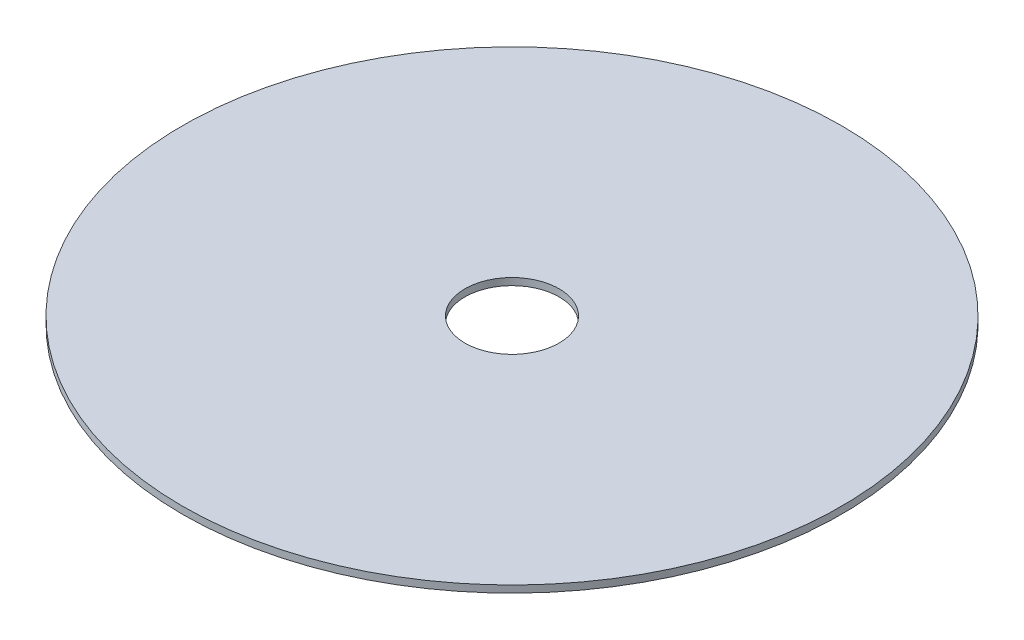
ISO-10303-21;
HEADER;
FILE_DESCRIPTION(('STEP AP214'),'2;1');
FILE_NAME('part.step','',(''),(''),'','','');
FILE_SCHEMA(('AUTOMOTIVE_DESIGN { 1 0 10303 214 1 1 1 1 }'));
ENDSEC;
DATA;
#1=APPLICATION_CONTEXT('core data for automotive mechanical design processes');
#2=APPLICATION_PROTOCOL_DEFINITION('international standard','automotive_design',2000,#1);
#3=PRODUCT_CONTEXT('',#1,'mechanical');
#4=PRODUCT('Part','Part','',(#3));
#5=PRODUCT_RELATED_PRODUCT_CATEGORY('part','',(#4));
#6=PRODUCT_DEFINITION_FORMATION('','',#4);
#7=PRODUCT_DEFINITION_CONTEXT('part definition',#1,'design');
#8=PRODUCT_DEFINITION('design','',#6,#7);
#9=PRODUCT_DEFINITION_SHAPE('','',#8);
#10=(LENGTH_UNIT() NAMED_UNIT(*) SI_UNIT(.MILLI.,.METRE.));
#11=(NAMED_UNIT(*) PLANE_ANGLE_UNIT() SI_UNIT($,.RADIAN.));
#12=(NAMED_UNIT(*) SI_UNIT($,.STERADIAN.) SOLID_ANGLE_UNIT());
#13=UNCERTAINTY_MEASURE_WITH_UNIT(LENGTH_MEASURE(1.E-05),#10,'distance_accuracy_value','');
#14=(GEOMETRIC_REPRESENTATION_CONTEXT(3) GLOBAL_UNCERTAINTY_ASSIGNED_CONTEXT((#13)) GLOBAL_UNIT_ASSIGNED_CONTEXT((#10,
#11,#12)) REPRESENTATION_CONTEXT('',''));
#15=CARTESIAN_POINT('',(0.,0.,0.));
#16=DIRECTION('',(0.,0.,1.));
#17=DIRECTION('',(1.,0.,0.));
#18=AXIS2_PLACEMENT_3D('',#15,#16,#17);
#19=CARTESIAN_POINT('',(0.,3.,0.));
#20=DIRECTION('',(0.,1.,0.));
#21=DIRECTION('',(0.,0.,1.));
#22=AXIS2_PLACEMENT_3D('',#19,#20,#21);
#23=PLANE('',#22);
#24=CARTESIAN_POINT('',(0.,3.,0.));
#25=DIRECTION('',(0.,1.,0.));
#26=DIRECTION('',(0.,0.,1.));
#27=AXIS2_PLACEMENT_3D('',#24,#25,#26);
#28=CIRCLE('',#27,140.);
#29=CARTESIAN_POINT('',(0.,3.,140.));
#30=VERTEX_POINT('',#29);
#31=EDGE_CURVE('E10',#30,#30,#28,.T.);
#32=ORIENTED_EDGE('',*,*,#31,.T.);
#33=EDGE_LOOP('',(#32));
#34=FACE_BOUND('',#33,.T.);
#35=CARTESIAN_POINT('',(0.,3.,0.));
#36=DIRECTION('',(0.,1.,0.));
#37=DIRECTION('',(0.,0.,1.));
#38=AXIS2_PLACEMENT_3D('',#35,#36,#37);
#39=CIRCLE('',#38,20.);
#40=CARTESIAN_POINT('',(0.,3.,20.));
#41=VERTEX_POINT('',#40);
#42=EDGE_CURVE('E50',#41,#41,#39,.T.);
#43=ORIENTED_EDGE('',*,*,#42,.F.);
#44=EDGE_LOOP('',(#43));
#45=FACE_BOUND('',#44,.T.);
#46=ADVANCED_FACE('F37',(#34,#45),#23,.T.);
#47=CARTESIAN_POINT('',(0.,0.,0.));
#48=DIRECTION('',(0.,1.,0.));
#49=DIRECTION('',(0.,0.,1.));
#50=AXIS2_PLACEMENT_3D('',#47,#48,#49);
#51=PLANE('',#50);
#52=CARTESIAN_POINT('',(0.,0.,0.));
#53=DIRECTION('',(0.,1.,0.));
#54=DIRECTION('',(0.,0.,1.));
#55=AXIS2_PLACEMENT_3D('',#52,#53,#54);
#56=CIRCLE('',#55,140.);
#57=CARTESIAN_POINT('',(0.,0.,140.));
#58=VERTEX_POINT('',#57);
#59=EDGE_CURVE('E41',#58,#58,#56,.T.);
#60=ORIENTED_EDGE('',*,*,#59,.F.);
#61=EDGE_LOOP('',(#60));
#62=FACE_BOUND('',#61,.T.);
#63=CARTESIAN_POINT('',(0.,0.,0.));
#64=DIRECTION('',(0.,1.,0.));
#65=DIRECTION('',(0.,0.,1.));
#66=AXIS2_PLACEMENT_3D('',#63,#64,#65);
#67=CIRCLE('',#66,20.);
#68=CARTESIAN_POINT('',(0.,0.,20.));
#69=VERTEX_POINT('',#68);
#70=EDGE_CURVE('E52',#69,#69,#67,.T.);
#71=ORIENTED_EDGE('',*,*,#70,.T.);
#72=EDGE_LOOP('',(#71));
#73=FACE_BOUND('',#72,.T.);
#74=ADVANCED_FACE('F64',(#62,#73),#51,.F.);
#75=CARTESIAN_POINT('',(0.,3.,0.));
#76=DIRECTION('',(0.,-1.,0.));
#77=DIRECTION('',(0.,0.,-1.));
#78=AXIS2_PLACEMENT_3D('',#75,#76,#77);
#79=CYLINDRICAL_SURFACE('',#78,140.);
#80=ORIENTED_EDGE('',*,*,#31,.F.);
#81=EDGE_LOOP('',(#80));
#82=FACE_BOUND('',#81,.T.);
#83=ORIENTED_EDGE('',*,*,#59,.T.);
#84=EDGE_LOOP('',(#83));
#85=FACE_BOUND('',#84,.T.);
#86=ADVANCED_FACE('F39',(#82,#85),#79,.T.);
#87=CARTESIAN_POINT('',(0.,3.,0.));
#88=DIRECTION('',(0.,-1.,0.));
#89=DIRECTION('',(0.,0.,-1.));
#90=AXIS2_PLACEMENT_3D('',#87,#88,#89);
#91=CYLINDRICAL_SURFACE('',#90,20.);
#92=ORIENTED_EDGE('',*,*,#42,.T.);
#93=EDGE_LOOP('',(#92));
#94=FACE_BOUND('',#93,.T.);
#95=ORIENTED_EDGE('',*,*,#70,.F.);
#96=EDGE_LOOP('',(#95));
#97=FACE_BOUND('',#96,.T.);
#98=ADVANCED_FACE('F60',(#94,#97),#91,.F.);
#99=CLOSED_SHELL('',(#46,#74,#86,#98));
#100=MANIFOLD_SOLID_BREP('B2',#99);
#101=ADVANCED_BREP_SHAPE_REPRESENTATION('',(#18,#100),#14);
#102=SHAPE_DEFINITION_REPRESENTATION(#9,#101);
ENDSEC;
END-ISO-10303-21;
